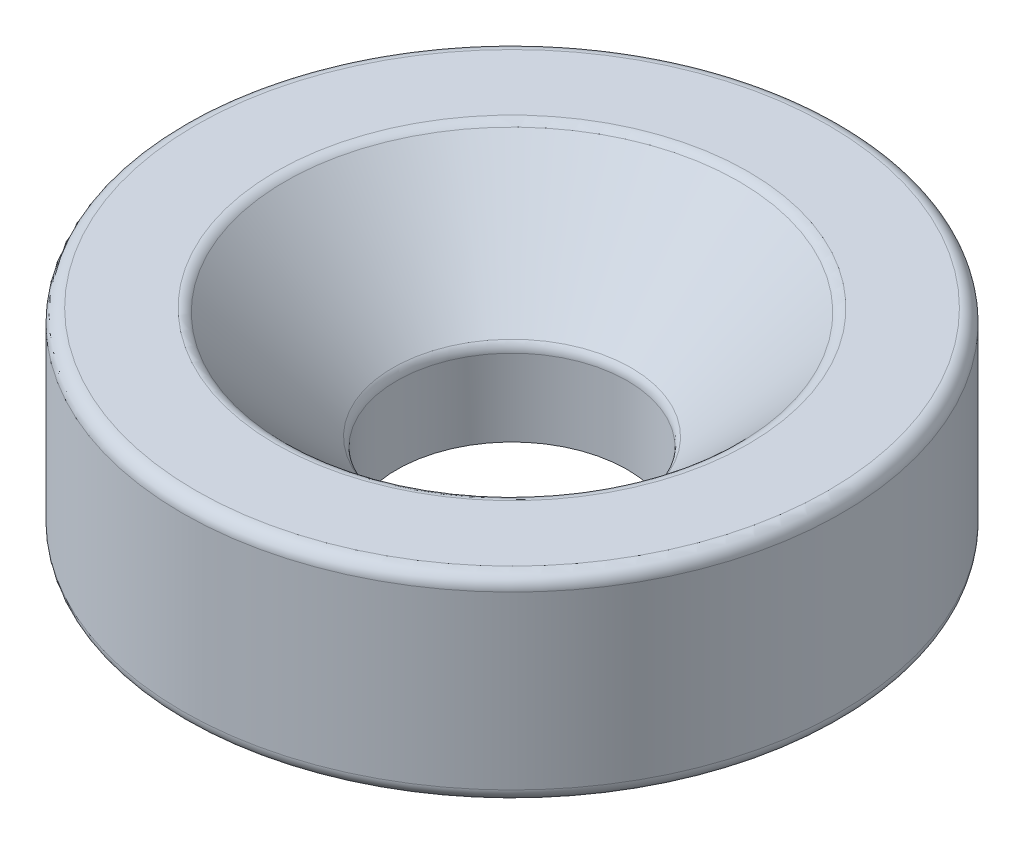
ISO-10303-21;
HEADER;
FILE_DESCRIPTION(('STEP AP214'),'2;1');
FILE_NAME('part.step','',(''),(''),'','','');
FILE_SCHEMA(('AUTOMOTIVE_DESIGN { 1 0 10303 214 1 1 1 1 }'));
ENDSEC;
DATA;
#1=APPLICATION_CONTEXT('core data for automotive mechanical design processes');
#2=APPLICATION_PROTOCOL_DEFINITION('international standard','automotive_design',2000,#1);
#3=PRODUCT_CONTEXT('',#1,'mechanical');
#4=PRODUCT('Part','Part','',(#3));
#5=PRODUCT_RELATED_PRODUCT_CATEGORY('part','',(#4));
#6=PRODUCT_DEFINITION_FORMATION('','',#4);
#7=PRODUCT_DEFINITION_CONTEXT('part definition',#1,'design');
#8=PRODUCT_DEFINITION('design','',#6,#7);
#9=PRODUCT_DEFINITION_SHAPE('','',#8);
#10=(LENGTH_UNIT() NAMED_UNIT(*) SI_UNIT(.MILLI.,.METRE.));
#11=(NAMED_UNIT(*) PLANE_ANGLE_UNIT() SI_UNIT($,.RADIAN.));
#12=(NAMED_UNIT(*) SI_UNIT($,.STERADIAN.) SOLID_ANGLE_UNIT());
#13=UNCERTAINTY_MEASURE_WITH_UNIT(LENGTH_MEASURE(1.E-05),#10,'distance_accuracy_value','');
#14=(GEOMETRIC_REPRESENTATION_CONTEXT(3) GLOBAL_UNCERTAINTY_ASSIGNED_CONTEXT((#13)) GLOBAL_UNIT_ASSIGNED_CONTEXT((#10,
#11,#12)) REPRESENTATION_CONTEXT('',''));
#15=CARTESIAN_POINT('',(0.,0.,0.));
#16=DIRECTION('',(0.,0.,1.));
#17=DIRECTION('',(1.,0.,0.));
#18=AXIS2_PLACEMENT_3D('',#15,#16,#17);
#19=CARTESIAN_POINT('',(0.,3.,0.));
#20=DIRECTION('',(0.,1.,0.));
#21=DIRECTION('',(0.,0.,1.));
#22=AXIS2_PLACEMENT_3D('',#19,#20,#21);
#23=PLANE('',#22);
#24=CARTESIAN_POINT('',(0.,3.,0.));
#25=DIRECTION('',(0.,1.,0.));
#26=DIRECTION('',(0.,0.,1.));
#27=AXIS2_PLACEMENT_3D('',#24,#25,#26);
#28=CIRCLE('',#27,3.58284271247462);
#29=CARTESIAN_POINT('',(0.,3.,3.58284271247462));
#30=VERTEX_POINT('',#29);
#31=EDGE_CURVE('E59',#30,#30,#28,.F.);
#32=ORIENTED_EDGE('',*,*,#31,.T.);
#33=EDGE_LOOP('',(#32));
#34=FACE_BOUND('',#33,.T.);
#35=CARTESIAN_POINT('',(0.,3.,0.));
#36=DIRECTION('',(0.,1.,0.));
#37=DIRECTION('',(0.,0.,1.));
#38=AXIS2_PLACEMENT_3D('',#35,#36,#37);
#39=CIRCLE('',#38,4.8);
#40=CARTESIAN_POINT('',(0.,3.,4.8));
#41=VERTEX_POINT('',#40);
#42=EDGE_CURVE('E62',#41,#41,#39,.T.);
#43=ORIENTED_EDGE('',*,*,#42,.T.);
#44=EDGE_LOOP('',(#43));
#45=FACE_BOUND('',#44,.T.);
#46=ADVANCED_FACE('F33',(#34,#45),#23,.T.);
#47=CARTESIAN_POINT('',(0.,0.,0.));
#48=DIRECTION('',(0.,1.,0.));
#49=DIRECTION('',(0.,0.,1.));
#50=AXIS2_PLACEMENT_3D('',#47,#48,#49);
#51=PLANE('',#50);
#52=CARTESIAN_POINT('',(0.,0.,0.));
#53=DIRECTION('',(0.,1.,0.));
#54=DIRECTION('',(0.,0.,1.));
#55=AXIS2_PLACEMENT_3D('',#52,#53,#54);
#56=CIRCLE('',#55,4.8);
#57=CARTESIAN_POINT('',(0.,0.,4.8));
#58=VERTEX_POINT('',#57);
#59=EDGE_CURVE('E40',#58,#58,#56,.F.);
#60=ORIENTED_EDGE('',*,*,#59,.T.);
#61=EDGE_LOOP('',(#60));
#62=FACE_BOUND('',#61,.T.);
#63=CARTESIAN_POINT('',(0.,0.,0.));
#64=DIRECTION('',(0.,1.,0.));
#65=DIRECTION('',(0.,0.,1.));
#66=AXIS2_PLACEMENT_3D('',#63,#64,#65);
#67=CIRCLE('',#66,1.75);
#68=CARTESIAN_POINT('',(0.,0.,1.75));
#69=VERTEX_POINT('',#68);
#70=EDGE_CURVE('E65',#69,#69,#67,.T.);
#71=ORIENTED_EDGE('',*,*,#70,.T.);
#72=EDGE_LOOP('',(#71));
#73=FACE_BOUND('',#72,.T.);
#74=ADVANCED_FACE('F69',(#62,#73),#51,.F.);
#75=CARTESIAN_POINT('',(0.,3.,0.));
#76=DIRECTION('',(0.,-1.,0.));
#77=DIRECTION('',(0.,0.,-1.));
#78=AXIS2_PLACEMENT_3D('',#75,#76,#77);
#79=CYLINDRICAL_SURFACE('',#78,5.);
#80=CARTESIAN_POINT('',(0.,0.2,0.));
#81=DIRECTION('',(0.,1.,0.));
#82=DIRECTION('',(0.,0.,1.));
#83=AXIS2_PLACEMENT_3D('',#80,#81,#82);
#84=CIRCLE('',#83,5.);
#85=CARTESIAN_POINT('',(0.,0.2,5.));
#86=VERTEX_POINT('',#85);
#87=EDGE_CURVE('E44',#86,#86,#84,.T.);
#88=ORIENTED_EDGE('',*,*,#87,.T.);
#89=EDGE_LOOP('',(#88));
#90=FACE_BOUND('',#89,.T.);
#91=CARTESIAN_POINT('',(0.,2.8,0.));
#92=DIRECTION('',(0.,1.,0.));
#93=DIRECTION('',(0.,0.,1.));
#94=AXIS2_PLACEMENT_3D('',#91,#92,#93);
#95=CIRCLE('',#94,5.);
#96=CARTESIAN_POINT('',(0.,2.8,5.));
#97=VERTEX_POINT('',#96);
#98=EDGE_CURVE('E48',#97,#97,#95,.F.);
#99=ORIENTED_EDGE('',*,*,#98,.T.);
#100=EDGE_LOOP('',(#99));
#101=FACE_BOUND('',#100,.T.);
#102=ADVANCED_FACE('F74',(#90,#101),#79,.T.);
#103=CARTESIAN_POINT('',(0.,3.,0.));
#104=DIRECTION('',(0.,-1.,0.));
#105=DIRECTION('',(0.,0.,-1.));
#106=AXIS2_PLACEMENT_3D('',#103,#104,#105);
#107=CYLINDRICAL_SURFACE('',#106,1.75);
#108=CARTESIAN_POINT('',(0.,1.16715728752538,0.));
#109=DIRECTION('',(0.,-1.,0.));
#110=DIRECTION('',(0.,0.,-1.));
#111=AXIS2_PLACEMENT_3D('',#108,#109,#110);
#112=CIRCLE('',#111,1.75);
#113=CARTESIAN_POINT('',(0.,1.16715728752538,-1.75));
#114=VERTEX_POINT('',#113);
#115=EDGE_CURVE('E10',#114,#114,#112,.F.);
#116=ORIENTED_EDGE('',*,*,#115,.T.);
#117=EDGE_LOOP('',(#116));
#118=FACE_BOUND('',#117,.T.);
#119=ORIENTED_EDGE('',*,*,#70,.F.);
#120=EDGE_LOOP('',(#119));
#121=FACE_BOUND('',#120,.T.);
#122=ADVANCED_FACE('F71',(#118,#121),#107,.F.);
#123=CARTESIAN_POINT('',(0.,1.25,0.));
#124=DIRECTION('',(0.,1.,0.));
#125=DIRECTION('',(0.,0.,1.));
#126=AXIS2_PLACEMENT_3D('',#123,#124,#125);
#127=CONICAL_SURFACE('',#126,1.75,0.785398163397448);
#128=CARTESIAN_POINT('',(0.,2.94142135623731,0.));
#129=DIRECTION('',(0.,-1.,0.));
#130=DIRECTION('',(0.,0.,-1.));
#131=AXIS2_PLACEMENT_3D('',#128,#129,#130);
#132=CIRCLE('',#131,3.44142135623731);
#133=CARTESIAN_POINT('',(0.,2.94142135623731,-3.44142135623731));
#134=VERTEX_POINT('',#133);
#135=EDGE_CURVE('E53',#134,#134,#132,.F.);
#136=ORIENTED_EDGE('',*,*,#135,.T.);
#137=EDGE_LOOP('',(#136));
#138=FACE_BOUND('',#137,.T.);
#139=CARTESIAN_POINT('',(0.,1.30857864376269,0.));
#140=DIRECTION('',(0.,-1.,0.));
#141=DIRECTION('',(0.,0.,-1.));
#142=AXIS2_PLACEMENT_3D('',#139,#140,#141);
#143=CIRCLE('',#142,1.80857864376269);
#144=CARTESIAN_POINT('',(0.,1.30857864376269,-1.80857864376269));
#145=VERTEX_POINT('',#144);
#146=EDGE_CURVE('E56',#145,#145,#143,.T.);
#147=ORIENTED_EDGE('',*,*,#146,.T.);
#148=EDGE_LOOP('',(#147));
#149=FACE_BOUND('',#148,.T.);
#150=ADVANCED_FACE('F73',(#138,#149),#127,.F.);
#151=CARTESIAN_POINT('',(0.,2.8,0.));
#152=DIRECTION('',(0.,1.,0.));
#153=DIRECTION('',(0.,0.,1.));
#154=AXIS2_PLACEMENT_3D('',#151,#152,#153);
#155=TOROIDAL_SURFACE('',#154,3.58284271247462,0.2);
#156=ORIENTED_EDGE('',*,*,#135,.F.);
#157=EDGE_LOOP('',(#156));
#158=FACE_BOUND('',#157,.T.);
#159=ORIENTED_EDGE('',*,*,#31,.F.);
#160=EDGE_LOOP('',(#159));
#161=FACE_BOUND('',#160,.T.);
#162=ADVANCED_FACE('F80',(#158,#161),#155,.T.);
#163=CARTESIAN_POINT('',(0.,0.2,0.));
#164=DIRECTION('',(0.,1.,0.));
#165=DIRECTION('',(0.,0.,1.));
#166=AXIS2_PLACEMENT_3D('',#163,#164,#165);
#167=TOROIDAL_SURFACE('',#166,4.8,0.2);
#168=ORIENTED_EDGE('',*,*,#59,.F.);
#169=EDGE_LOOP('',(#168));
#170=FACE_BOUND('',#169,.T.);
#171=ORIENTED_EDGE('',*,*,#87,.F.);
#172=EDGE_LOOP('',(#171));
#173=FACE_BOUND('',#172,.T.);
#174=ADVANCED_FACE('F96',(#170,#173),#167,.T.);
#175=CARTESIAN_POINT('',(0.,2.8,0.));
#176=DIRECTION('',(0.,1.,0.));
#177=DIRECTION('',(0.,0.,1.));
#178=AXIS2_PLACEMENT_3D('',#175,#176,#177);
#179=TOROIDAL_SURFACE('',#178,4.8,0.2);
#180=ORIENTED_EDGE('',*,*,#98,.F.);
#181=EDGE_LOOP('',(#180));
#182=FACE_BOUND('',#181,.T.);
#183=ORIENTED_EDGE('',*,*,#42,.F.);
#184=EDGE_LOOP('',(#183));
#185=FACE_BOUND('',#184,.T.);
#186=ADVANCED_FACE('F99',(#182,#185),#179,.T.);
#187=CARTESIAN_POINT('',(0.,1.16715728752538,0.));
#188=DIRECTION('',(0.,-1.,0.));
#189=DIRECTION('',(0.,0.,-1.));
#190=AXIS2_PLACEMENT_3D('',#187,#188,#189);
#191=TOROIDAL_SURFACE('',#190,1.95,0.2);
#192=ORIENTED_EDGE('',*,*,#146,.F.);
#193=EDGE_LOOP('',(#192));
#194=FACE_BOUND('',#193,.T.);
#195=ORIENTED_EDGE('',*,*,#115,.F.);
#196=EDGE_LOOP('',(#195));
#197=FACE_BOUND('',#196,.T.);
#198=ADVANCED_FACE('F35',(#194,#197),#191,.T.);
#199=CLOSED_SHELL('',(#46,#74,#102,#122,#150,#162,#174,#186,#198));
#200=MANIFOLD_SOLID_BREP('B2',#199);
#201=ADVANCED_BREP_SHAPE_REPRESENTATION('',(#18,#200),#14);
#202=SHAPE_DEFINITION_REPRESENTATION(#9,#201);
ENDSEC;
END-ISO-10303-21;
